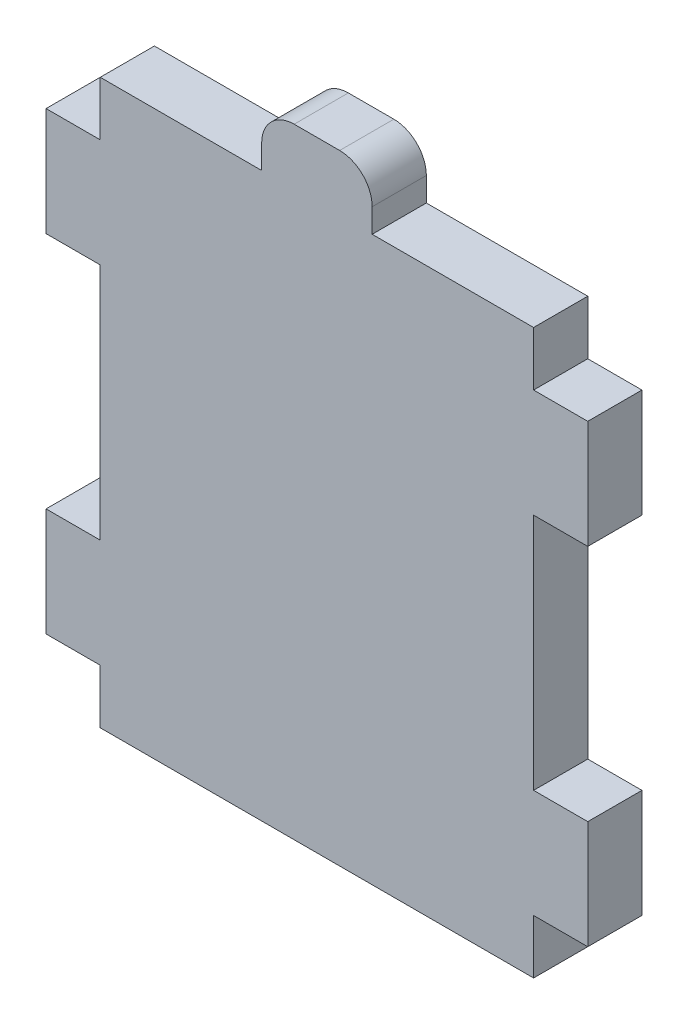
ISO-10303-21;
HEADER;
FILE_DESCRIPTION(('STEP AP214'),'2;1');
FILE_NAME('part.step','',(''),(''),'','','');
FILE_SCHEMA(('AUTOMOTIVE_DESIGN { 1 0 10303 214 1 1 1 1 }'));
ENDSEC;
DATA;
#1=APPLICATION_CONTEXT('core data for automotive mechanical design processes');
#2=APPLICATION_PROTOCOL_DEFINITION('international standard','automotive_design',2000,#1);
#3=PRODUCT_CONTEXT('',#1,'mechanical');
#4=PRODUCT('Part','Part','',(#3));
#5=PRODUCT_RELATED_PRODUCT_CATEGORY('part','',(#4));
#6=PRODUCT_DEFINITION_FORMATION('','',#4);
#7=PRODUCT_DEFINITION_CONTEXT('part definition',#1,'design');
#8=PRODUCT_DEFINITION('design','',#6,#7);
#9=PRODUCT_DEFINITION_SHAPE('','',#8);
#10=(LENGTH_UNIT() NAMED_UNIT(*) SI_UNIT(.MILLI.,.METRE.));
#11=(NAMED_UNIT(*) PLANE_ANGLE_UNIT() SI_UNIT($,.RADIAN.));
#12=(NAMED_UNIT(*) SI_UNIT($,.STERADIAN.) SOLID_ANGLE_UNIT());
#13=UNCERTAINTY_MEASURE_WITH_UNIT(LENGTH_MEASURE(1.E-05),#10,'distance_accuracy_value','');
#14=(GEOMETRIC_REPRESENTATION_CONTEXT(3) GLOBAL_UNCERTAINTY_ASSIGNED_CONTEXT((#13)) GLOBAL_UNIT_ASSIGNED_CONTEXT((#10,
#11,#12)) REPRESENTATION_CONTEXT('',''));
#15=CARTESIAN_POINT('',(0.,0.,0.));
#16=DIRECTION('',(0.,0.,1.));
#17=DIRECTION('',(1.,0.,0.));
#18=AXIS2_PLACEMENT_3D('',#15,#16,#17);
#19=CARTESIAN_POINT('',(0.,66.04,6.35));
#20=DIRECTION('',(0.,-1.,0.));
#21=DIRECTION('',(0.,0.,-1.));
#22=AXIS2_PLACEMENT_3D('',#19,#20,#21);
#23=PLANE('',#22);
#24=DIRECTION('',(0.,0.,-1.));
#25=VECTOR('',#24,1.);
#26=CARTESIAN_POINT('',(31.877,66.04,6.35));
#27=LINE('',#26,#25);
#28=CARTESIAN_POINT('',(31.877,66.04,6.35));
#29=VERTEX_POINT('',#28);
#30=CARTESIAN_POINT('',(31.877,66.04,0.));
#31=VERTEX_POINT('',#30);
#32=EDGE_CURVE('E440',#29,#31,#27,.T.);
#33=ORIENTED_EDGE('',*,*,#32,.F.);
#34=DIRECTION('',(-1.,0.,0.));
#35=VECTOR('',#34,1.);
#36=CARTESIAN_POINT('',(0.,66.04,6.35));
#37=LINE('',#36,#35);
#38=CARTESIAN_POINT('',(50.8,66.04,6.35));
#39=VERTEX_POINT('',#38);
#40=EDGE_CURVE('E361',#39,#29,#37,.T.);
#41=ORIENTED_EDGE('',*,*,#40,.F.);
#42=DIRECTION('',(0.,0.,-1.));
#43=VECTOR('',#42,1.);
#44=CARTESIAN_POINT('',(50.8,66.04,6.35));
#45=LINE('',#44,#43);
#46=CARTESIAN_POINT('',(50.8,66.04,0.));
#47=VERTEX_POINT('',#46);
#48=EDGE_CURVE('E381',#39,#47,#45,.T.);
#49=ORIENTED_EDGE('',*,*,#48,.T.);
#50=DIRECTION('',(-1.,0.,0.));
#51=VECTOR('',#50,1.);
#52=CARTESIAN_POINT('',(0.,66.04,0.));
#53=LINE('',#52,#51);
#54=EDGE_CURVE('E376',#47,#31,#53,.T.);
#55=ORIENTED_EDGE('',*,*,#54,.T.);
#56=EDGE_LOOP('',(#33,#41,#49,#55));
#57=FACE_BOUND('',#56,.T.);
#58=ADVANCED_FACE('F39',(#57),#23,.F.);
#59=CARTESIAN_POINT('',(50.8,0.,6.35));
#60=DIRECTION('',(-1.,0.,0.));
#61=DIRECTION('',(0.,-1.,0.));
#62=AXIS2_PLACEMENT_3D('',#59,#60,#61);
#63=PLANE('',#62);
#64=DIRECTION('',(0.,0.,-1.));
#65=VECTOR('',#64,1.);
#66=CARTESIAN_POINT('',(50.8,46.99,6.35));
#67=LINE('',#66,#65);
#68=CARTESIAN_POINT('',(50.8,46.99,6.35));
#69=VERTEX_POINT('',#68);
#70=CARTESIAN_POINT('',(50.8,46.99,0.));
#71=VERTEX_POINT('',#70);
#72=EDGE_CURVE('E235',#69,#71,#67,.T.);
#73=ORIENTED_EDGE('',*,*,#72,.F.);
#74=DIRECTION('',(0.,1.,0.));
#75=VECTOR('',#74,1.);
#76=CARTESIAN_POINT('',(50.8,0.,6.35));
#77=LINE('',#76,#75);
#78=CARTESIAN_POINT('',(50.8,19.05,6.35));
#79=VERTEX_POINT('',#78);
#80=EDGE_CURVE('E360',#79,#69,#77,.T.);
#81=ORIENTED_EDGE('',*,*,#80,.F.);
#82=DIRECTION('',(0.,0.,-1.));
#83=VECTOR('',#82,1.);
#84=CARTESIAN_POINT('',(50.8,19.05,6.35));
#85=LINE('',#84,#83);
#86=CARTESIAN_POINT('',(50.8,19.05,0.));
#87=VERTEX_POINT('',#86);
#88=EDGE_CURVE('E279',#79,#87,#85,.T.);
#89=ORIENTED_EDGE('',*,*,#88,.T.);
#90=DIRECTION('',(0.,1.,0.));
#91=VECTOR('',#90,1.);
#92=CARTESIAN_POINT('',(50.8,0.,0.));
#93=LINE('',#92,#91);
#94=EDGE_CURVE('E375',#87,#71,#93,.T.);
#95=ORIENTED_EDGE('',*,*,#94,.T.);
#96=EDGE_LOOP('',(#73,#81,#89,#95));
#97=FACE_BOUND('',#96,.T.);
#98=ADVANCED_FACE('F473',(#97),#63,.F.);
#99=DIRECTION('',(0.,0.,-1.));
#100=VECTOR('',#99,1.);
#101=CARTESIAN_POINT('',(50.8,59.69,6.35));
#102=LINE('',#101,#100);
#103=CARTESIAN_POINT('',(50.8,59.69,6.35));
#104=VERTEX_POINT('',#103);
#105=CARTESIAN_POINT('',(50.8,59.69,0.));
#106=VERTEX_POINT('',#105);
#107=EDGE_CURVE('E258',#104,#106,#102,.T.);
#108=ORIENTED_EDGE('',*,*,#107,.T.);
#109=EDGE_CURVE('E371',#106,#47,#93,.T.);
#110=ORIENTED_EDGE('',*,*,#109,.T.);
#111=ORIENTED_EDGE('',*,*,#48,.F.);
#112=EDGE_CURVE('E62',#104,#39,#77,.T.);
#113=ORIENTED_EDGE('',*,*,#112,.F.);
#114=EDGE_LOOP('',(#108,#110,#111,#113));
#115=FACE_BOUND('',#114,.T.);
#116=ADVANCED_FACE('F467',(#115),#63,.F.);
#117=DIRECTION('',(0.,0.,-1.));
#118=VECTOR('',#117,1.);
#119=CARTESIAN_POINT('',(50.8,6.35000000000001,6.35));
#120=LINE('',#119,#118);
#121=CARTESIAN_POINT('',(50.8,6.35000000000001,6.35));
#122=VERTEX_POINT('',#121);
#123=CARTESIAN_POINT('',(50.8,6.35000000000001,0.));
#124=VERTEX_POINT('',#123);
#125=EDGE_CURVE('E282',#122,#124,#120,.T.);
#126=ORIENTED_EDGE('',*,*,#125,.F.);
#127=CARTESIAN_POINT('',(50.8,0.,6.35));
#128=VERTEX_POINT('',#127);
#129=EDGE_CURVE('E356',#128,#122,#77,.T.);
#130=ORIENTED_EDGE('',*,*,#129,.F.);
#131=DIRECTION('',(0.,0.,-1.));
#132=VECTOR('',#131,1.);
#133=CARTESIAN_POINT('',(50.8,0.,6.35));
#134=LINE('',#133,#132);
#135=CARTESIAN_POINT('',(50.8,0.,0.));
#136=VERTEX_POINT('',#135);
#137=EDGE_CURVE('E47',#128,#136,#134,.T.);
#138=ORIENTED_EDGE('',*,*,#137,.T.);
#139=EDGE_CURVE('E372',#136,#124,#93,.T.);
#140=ORIENTED_EDGE('',*,*,#139,.T.);
#141=EDGE_LOOP('',(#126,#130,#138,#140));
#142=FACE_BOUND('',#141,.T.);
#143=ADVANCED_FACE('F389',(#142),#63,.F.);
#144=CARTESIAN_POINT('',(0.,0.,6.35));
#145=DIRECTION('',(1.,0.,0.));
#146=DIRECTION('',(0.,0.,-1.));
#147=AXIS2_PLACEMENT_3D('',#144,#145,#146);
#148=PLANE('',#147);
#149=DIRECTION('',(0.,0.,-1.));
#150=VECTOR('',#149,1.);
#151=CARTESIAN_POINT('',(0.,19.05,6.35));
#152=LINE('',#151,#150);
#153=CARTESIAN_POINT('',(0.,19.05,6.35));
#154=VERTEX_POINT('',#153);
#155=CARTESIAN_POINT('',(0.,19.05,0.));
#156=VERTEX_POINT('',#155);
#157=EDGE_CURVE('E293',#154,#156,#152,.T.);
#158=ORIENTED_EDGE('',*,*,#157,.F.);
#159=DIRECTION('',(0.,-1.,0.));
#160=VECTOR('',#159,1.);
#161=CARTESIAN_POINT('',(0.,0.,6.35));
#162=LINE('',#161,#160);
#163=CARTESIAN_POINT('',(0.,46.99,6.35));
#164=VERTEX_POINT('',#163);
#165=EDGE_CURVE('E353',#164,#154,#162,.T.);
#166=ORIENTED_EDGE('',*,*,#165,.F.);
#167=DIRECTION('',(0.,0.,-1.));
#168=VECTOR('',#167,1.);
#169=CARTESIAN_POINT('',(0.,46.99,6.35));
#170=LINE('',#169,#168);
#171=CARTESIAN_POINT('',(0.,46.99,0.));
#172=VERTEX_POINT('',#171);
#173=EDGE_CURVE('E332',#164,#172,#170,.T.);
#174=ORIENTED_EDGE('',*,*,#173,.T.);
#175=DIRECTION('',(0.,-1.,0.));
#176=VECTOR('',#175,1.);
#177=CARTESIAN_POINT('',(0.,0.,0.));
#178=LINE('',#177,#176);
#179=EDGE_CURVE('E369',#172,#156,#178,.T.);
#180=ORIENTED_EDGE('',*,*,#179,.T.);
#181=EDGE_LOOP('',(#158,#166,#174,#180));
#182=FACE_BOUND('',#181,.T.);
#183=ADVANCED_FACE('F41',(#182),#148,.F.);
#184=DIRECTION('',(0.,0.,-1.));
#185=VECTOR('',#184,1.);
#186=CARTESIAN_POINT('',(0.,6.35,6.35));
#187=LINE('',#186,#185);
#188=CARTESIAN_POINT('',(0.,6.35,6.35));
#189=VERTEX_POINT('',#188);
#190=CARTESIAN_POINT('',(0.,6.35,0.));
#191=VERTEX_POINT('',#190);
#192=EDGE_CURVE('E307',#189,#191,#187,.T.);
#193=ORIENTED_EDGE('',*,*,#192,.T.);
#194=CARTESIAN_POINT('',(0.,0.,0.));
#195=VERTEX_POINT('',#194);
#196=EDGE_CURVE('E348',#191,#195,#178,.T.);
#197=ORIENTED_EDGE('',*,*,#196,.T.);
#198=DIRECTION('',(0.,0.,-1.));
#199=VECTOR('',#198,1.);
#200=CARTESIAN_POINT('',(0.,0.,6.35));
#201=LINE('',#200,#199);
#202=CARTESIAN_POINT('',(0.,0.,6.35));
#203=VERTEX_POINT('',#202);
#204=EDGE_CURVE('E11',#203,#195,#201,.T.);
#205=ORIENTED_EDGE('',*,*,#204,.F.);
#206=EDGE_CURVE('E354',#189,#203,#162,.T.);
#207=ORIENTED_EDGE('',*,*,#206,.F.);
#208=EDGE_LOOP('',(#193,#197,#205,#207));
#209=FACE_BOUND('',#208,.T.);
#210=ADVANCED_FACE('F403',(#209),#148,.F.);
#211=DIRECTION('',(0.,0.,-1.));
#212=VECTOR('',#211,1.);
#213=CARTESIAN_POINT('',(0.,59.69,6.35));
#214=LINE('',#213,#212);
#215=CARTESIAN_POINT('',(0.,59.69,6.35));
#216=VERTEX_POINT('',#215);
#217=CARTESIAN_POINT('',(0.,59.69,0.));
#218=VERTEX_POINT('',#217);
#219=EDGE_CURVE('E345',#216,#218,#214,.T.);
#220=ORIENTED_EDGE('',*,*,#219,.F.);
#221=CARTESIAN_POINT('',(0.,66.04,6.35));
#222=VERTEX_POINT('',#221);
#223=EDGE_CURVE('E349',#222,#216,#162,.T.);
#224=ORIENTED_EDGE('',*,*,#223,.F.);
#225=DIRECTION('',(0.,0.,-1.));
#226=VECTOR('',#225,1.);
#227=CARTESIAN_POINT('',(0.,66.04,6.35));
#228=LINE('',#227,#226);
#229=CARTESIAN_POINT('',(0.,66.04,0.));
#230=VERTEX_POINT('',#229);
#231=EDGE_CURVE('E364',#222,#230,#228,.T.);
#232=ORIENTED_EDGE('',*,*,#231,.T.);
#233=EDGE_CURVE('E365',#230,#218,#178,.T.);
#234=ORIENTED_EDGE('',*,*,#233,.T.);
#235=EDGE_LOOP('',(#220,#224,#232,#234));
#236=FACE_BOUND('',#235,.T.);
#237=ADVANCED_FACE('F434',(#236),#148,.F.);
#238=CARTESIAN_POINT('',(0.,0.,6.35));
#239=DIRECTION('',(0.,1.,0.));
#240=DIRECTION('',(0.,0.,1.));
#241=AXIS2_PLACEMENT_3D('',#238,#239,#240);
#242=PLANE('',#241);
#243=DIRECTION('',(1.,0.,0.));
#244=VECTOR('',#243,1.);
#245=CARTESIAN_POINT('',(0.,0.,0.));
#246=LINE('',#245,#244);
#247=EDGE_CURVE('E368',#195,#136,#246,.T.);
#248=ORIENTED_EDGE('',*,*,#247,.T.);
#249=ORIENTED_EDGE('',*,*,#137,.F.);
#250=DIRECTION('',(1.,0.,0.));
#251=VECTOR('',#250,1.);
#252=CARTESIAN_POINT('',(0.,0.,6.35));
#253=LINE('',#252,#251);
#254=EDGE_CURVE('E352',#203,#128,#253,.T.);
#255=ORIENTED_EDGE('',*,*,#254,.F.);
#256=ORIENTED_EDGE('',*,*,#204,.T.);
#257=EDGE_LOOP('',(#248,#249,#255,#256));
#258=FACE_BOUND('',#257,.T.);
#259=ADVANCED_FACE('F401',(#258),#242,.F.);
#260=CARTESIAN_POINT('',(18.923,66.04,6.35));
#261=VERTEX_POINT('',#260);
#262=EDGE_CURVE('E359',#261,#222,#37,.T.);
#263=ORIENTED_EDGE('',*,*,#262,.F.);
#264=DIRECTION('',(0.,0.,-1.));
#265=VECTOR('',#264,1.);
#266=CARTESIAN_POINT('',(18.923,66.04,6.35));
#267=LINE('',#266,#265);
#268=CARTESIAN_POINT('',(18.923,66.04,0.));
#269=VERTEX_POINT('',#268);
#270=EDGE_CURVE('E439',#261,#269,#267,.T.);
#271=ORIENTED_EDGE('',*,*,#270,.T.);
#272=EDGE_CURVE('E234',#269,#230,#53,.T.);
#273=ORIENTED_EDGE('',*,*,#272,.T.);
#274=ORIENTED_EDGE('',*,*,#231,.F.);
#275=EDGE_LOOP('',(#263,#271,#273,#274));
#276=FACE_BOUND('',#275,.T.);
#277=ADVANCED_FACE('F438',(#276),#23,.F.);
#278=CARTESIAN_POINT('',(0.,0.,6.35));
#279=DIRECTION('',(0.,0.,-1.));
#280=DIRECTION('',(-1.,0.,0.));
#281=AXIS2_PLACEMENT_3D('',#278,#279,#280);
#282=PLANE('',#281);
#283=ORIENTED_EDGE('',*,*,#223,.T.);
#284=DIRECTION('',(-1.,0.,0.));
#285=VECTOR('',#284,1.);
#286=CARTESIAN_POINT('',(0.,59.69,6.35));
#287=LINE('',#286,#285);
#288=CARTESIAN_POINT('',(-6.35,59.69,6.35));
#289=VERTEX_POINT('',#288);
#290=EDGE_CURVE('E325',#216,#289,#287,.T.);
#291=ORIENTED_EDGE('',*,*,#290,.T.);
#292=DIRECTION('',(0.,-1.,0.));
#293=VECTOR('',#292,1.);
#294=CARTESIAN_POINT('',(-6.35,59.69,6.35));
#295=LINE('',#294,#293);
#296=CARTESIAN_POINT('',(-6.35,46.99,6.35));
#297=VERTEX_POINT('',#296);
#298=EDGE_CURVE('E327',#289,#297,#295,.T.);
#299=ORIENTED_EDGE('',*,*,#298,.T.);
#300=DIRECTION('',(1.,0.,0.));
#301=VECTOR('',#300,1.);
#302=CARTESIAN_POINT('',(0.,46.99,6.35));
#303=LINE('',#302,#301);
#304=EDGE_CURVE('E330',#297,#164,#303,.T.);
#305=ORIENTED_EDGE('',*,*,#304,.T.);
#306=ORIENTED_EDGE('',*,*,#165,.T.);
#307=DIRECTION('',(-1.,0.,0.));
#308=VECTOR('',#307,1.);
#309=CARTESIAN_POINT('',(0.,19.05,6.35));
#310=LINE('',#309,#308);
#311=CARTESIAN_POINT('',(-6.35,19.05,6.35));
#312=VERTEX_POINT('',#311);
#313=EDGE_CURVE('E315',#154,#312,#310,.T.);
#314=ORIENTED_EDGE('',*,*,#313,.T.);
#315=DIRECTION('',(0.,-1.,0.));
#316=VECTOR('',#315,1.);
#317=CARTESIAN_POINT('',(-6.35,6.35,6.35));
#318=LINE('',#317,#316);
#319=CARTESIAN_POINT('',(-6.35,6.35,6.35));
#320=VERTEX_POINT('',#319);
#321=EDGE_CURVE('E322',#312,#320,#318,.T.);
#322=ORIENTED_EDGE('',*,*,#321,.T.);
#323=DIRECTION('',(1.,0.,0.));
#324=VECTOR('',#323,1.);
#325=CARTESIAN_POINT('',(0.,6.35,6.35));
#326=LINE('',#325,#324);
#327=EDGE_CURVE('E310',#320,#189,#326,.T.);
#328=ORIENTED_EDGE('',*,*,#327,.T.);
#329=ORIENTED_EDGE('',*,*,#206,.T.);
#330=ORIENTED_EDGE('',*,*,#254,.T.);
#331=ORIENTED_EDGE('',*,*,#129,.T.);
#332=DIRECTION('',(1.,0.,0.));
#333=VECTOR('',#332,1.);
#334=CARTESIAN_POINT('',(50.8,6.35000000000001,6.35));
#335=LINE('',#334,#333);
#336=CARTESIAN_POINT('',(57.15,6.35000000000001,6.35));
#337=VERTEX_POINT('',#336);
#338=EDGE_CURVE('E288',#122,#337,#335,.T.);
#339=ORIENTED_EDGE('',*,*,#338,.T.);
#340=DIRECTION('',(0.,1.,0.));
#341=VECTOR('',#340,1.);
#342=CARTESIAN_POINT('',(57.15,6.35000000000001,6.35));
#343=LINE('',#342,#341);
#344=CARTESIAN_POINT('',(57.15,19.05,6.35));
#345=VERTEX_POINT('',#344);
#346=EDGE_CURVE('E295',#337,#345,#343,.T.);
#347=ORIENTED_EDGE('',*,*,#346,.T.);
#348=DIRECTION('',(-1.,0.,0.));
#349=VECTOR('',#348,1.);
#350=CARTESIAN_POINT('',(50.8,19.05,6.35));
#351=LINE('',#350,#349);
#352=EDGE_CURVE('E284',#345,#79,#351,.T.);
#353=ORIENTED_EDGE('',*,*,#352,.T.);
#354=ORIENTED_EDGE('',*,*,#80,.T.);
#355=DIRECTION('',(1.,0.,0.));
#356=VECTOR('',#355,1.);
#357=CARTESIAN_POINT('',(50.8,46.99,6.35));
#358=LINE('',#357,#356);
#359=CARTESIAN_POINT('',(57.15,46.99,6.35));
#360=VERTEX_POINT('',#359);
#361=EDGE_CURVE('E265',#69,#360,#358,.T.);
#362=ORIENTED_EDGE('',*,*,#361,.T.);
#363=DIRECTION('',(0.,1.,0.));
#364=VECTOR('',#363,1.);
#365=CARTESIAN_POINT('',(57.15,59.69,6.35));
#366=LINE('',#365,#364);
#367=CARTESIAN_POINT('',(57.15,59.69,6.35));
#368=VERTEX_POINT('',#367);
#369=EDGE_CURVE('E271',#360,#368,#366,.T.);
#370=ORIENTED_EDGE('',*,*,#369,.T.);
#371=DIRECTION('',(-1.,0.,0.));
#372=VECTOR('',#371,1.);
#373=CARTESIAN_POINT('',(50.8,59.69,6.35));
#374=LINE('',#373,#372);
#375=EDGE_CURVE('E260',#368,#104,#374,.T.);
#376=ORIENTED_EDGE('',*,*,#375,.T.);
#377=ORIENTED_EDGE('',*,*,#112,.T.);
#378=ORIENTED_EDGE('',*,*,#40,.T.);
#379=DIRECTION('',(0.,1.,0.));
#380=VECTOR('',#379,1.);
#381=CARTESIAN_POINT('',(31.877,66.04,6.35));
#382=LINE('',#381,#380);
#383=CARTESIAN_POINT('',(31.877,68.834,6.35));
#384=VERTEX_POINT('',#383);
#385=EDGE_CURVE('E250',#29,#384,#382,.T.);
#386=ORIENTED_EDGE('',*,*,#385,.T.);
#387=CARTESIAN_POINT('',(28.067,68.834,6.35));
#388=DIRECTION('',(0.,0.,1.));
#389=DIRECTION('',(-1.,0.,0.));
#390=AXIS2_PLACEMENT_3D('',#387,#388,#389);
#391=CIRCLE('',#390,3.80999999999999);
#392=CARTESIAN_POINT('',(28.067,72.644,6.35));
#393=VERTEX_POINT('',#392);
#394=EDGE_CURVE('E248',#384,#393,#391,.T.);
#395=ORIENTED_EDGE('',*,*,#394,.T.);
#396=DIRECTION('',(-1.,0.,0.));
#397=VECTOR('',#396,1.);
#398=CARTESIAN_POINT('',(22.733,72.644,6.35));
#399=LINE('',#398,#397);
#400=CARTESIAN_POINT('',(22.733,72.644,6.35));
#401=VERTEX_POINT('',#400);
#402=EDGE_CURVE('E246',#393,#401,#399,.T.);
#403=ORIENTED_EDGE('',*,*,#402,.T.);
#404=CARTESIAN_POINT('',(22.733,68.834,6.35));
#405=DIRECTION('',(0.,0.,1.));
#406=DIRECTION('',(-1.,0.,0.));
#407=AXIS2_PLACEMENT_3D('',#404,#405,#406);
#408=CIRCLE('',#407,3.80999999999999);
#409=CARTESIAN_POINT('',(18.923,68.834,6.35));
#410=VERTEX_POINT('',#409);
#411=EDGE_CURVE('E229',#401,#410,#408,.T.);
#412=ORIENTED_EDGE('',*,*,#411,.T.);
#413=DIRECTION('',(0.,-1.,0.));
#414=VECTOR('',#413,1.);
#415=CARTESIAN_POINT('',(18.923,66.04,6.35));
#416=LINE('',#415,#414);
#417=EDGE_CURVE('E226',#410,#261,#416,.T.);
#418=ORIENTED_EDGE('',*,*,#417,.T.);
#419=ORIENTED_EDGE('',*,*,#262,.T.);
#420=EDGE_LOOP('',(#283,#291,#299,#305,#306,#314,#322,#328,#329,#330,#331,#339,#347,#353,#354,
#362,#370,#376,#377,#378,#386,#395,#403,#412,#418,#419));
#421=FACE_BOUND('',#420,.T.);
#422=ADVANCED_FACE('F399',(#421),#282,.F.);
#423=CARTESIAN_POINT('',(0.,0.,0.));
#424=DIRECTION('',(0.,0.,-1.));
#425=DIRECTION('',(-1.,0.,0.));
#426=AXIS2_PLACEMENT_3D('',#423,#424,#425);
#427=PLANE('',#426);
#428=ORIENTED_EDGE('',*,*,#233,.F.);
#429=ORIENTED_EDGE('',*,*,#272,.F.);
#430=DIRECTION('',(0.,-1.,0.));
#431=VECTOR('',#430,1.);
#432=CARTESIAN_POINT('',(18.923,66.04,0.));
#433=LINE('',#432,#431);
#434=CARTESIAN_POINT('',(18.923,68.834,0.));
#435=VERTEX_POINT('',#434);
#436=EDGE_CURVE('E54',#435,#269,#433,.T.);
#437=ORIENTED_EDGE('',*,*,#436,.F.);
#438=CARTESIAN_POINT('',(22.733,68.834,0.));
#439=DIRECTION('',(0.,0.,1.));
#440=DIRECTION('',(-1.,0.,0.));
#441=AXIS2_PLACEMENT_3D('',#438,#439,#440);
#442=CIRCLE('',#441,3.80999999999999);
#443=CARTESIAN_POINT('',(22.733,72.644,0.));
#444=VERTEX_POINT('',#443);
#445=EDGE_CURVE('E216',#444,#435,#442,.T.);
#446=ORIENTED_EDGE('',*,*,#445,.F.);
#447=DIRECTION('',(-1.,0.,0.));
#448=VECTOR('',#447,1.);
#449=CARTESIAN_POINT('',(22.733,72.644,0.));
#450=LINE('',#449,#448);
#451=CARTESIAN_POINT('',(28.067,72.644,0.));
#452=VERTEX_POINT('',#451);
#453=EDGE_CURVE('E225',#452,#444,#450,.T.);
#454=ORIENTED_EDGE('',*,*,#453,.F.);
#455=CARTESIAN_POINT('',(28.067,68.834,0.));
#456=DIRECTION('',(0.,0.,1.));
#457=DIRECTION('',(-1.,0.,0.));
#458=AXIS2_PLACEMENT_3D('',#455,#456,#457);
#459=CIRCLE('',#458,3.80999999999999);
#460=CARTESIAN_POINT('',(31.877,68.834,0.));
#461=VERTEX_POINT('',#460);
#462=EDGE_CURVE('E241',#461,#452,#459,.T.);
#463=ORIENTED_EDGE('',*,*,#462,.F.);
#464=DIRECTION('',(0.,1.,0.));
#465=VECTOR('',#464,1.);
#466=CARTESIAN_POINT('',(31.877,66.04,0.));
#467=LINE('',#466,#465);
#468=EDGE_CURVE('E236',#31,#461,#467,.T.);
#469=ORIENTED_EDGE('',*,*,#468,.F.);
#470=ORIENTED_EDGE('',*,*,#54,.F.);
#471=ORIENTED_EDGE('',*,*,#109,.F.);
#472=DIRECTION('',(-1.,0.,0.));
#473=VECTOR('',#472,1.);
#474=CARTESIAN_POINT('',(50.8,59.69,0.));
#475=LINE('',#474,#473);
#476=CARTESIAN_POINT('',(57.15,59.69,0.));
#477=VERTEX_POINT('',#476);
#478=EDGE_CURVE('E261',#477,#106,#475,.T.);
#479=ORIENTED_EDGE('',*,*,#478,.F.);
#480=DIRECTION('',(0.,1.,0.));
#481=VECTOR('',#480,1.);
#482=CARTESIAN_POINT('',(57.15,59.69,0.));
#483=LINE('',#482,#481);
#484=CARTESIAN_POINT('',(57.15,46.99,0.));
#485=VERTEX_POINT('',#484);
#486=EDGE_CURVE('E264',#485,#477,#483,.T.);
#487=ORIENTED_EDGE('',*,*,#486,.F.);
#488=DIRECTION('',(1.,0.,0.));
#489=VECTOR('',#488,1.);
#490=CARTESIAN_POINT('',(50.8,46.99,0.));
#491=LINE('',#490,#489);
#492=EDGE_CURVE('E267',#71,#485,#491,.T.);
#493=ORIENTED_EDGE('',*,*,#492,.F.);
#494=ORIENTED_EDGE('',*,*,#94,.F.);
#495=DIRECTION('',(-1.,0.,0.));
#496=VECTOR('',#495,1.);
#497=CARTESIAN_POINT('',(50.8,19.05,0.));
#498=LINE('',#497,#496);
#499=CARTESIAN_POINT('',(57.15,19.05,0.));
#500=VERTEX_POINT('',#499);
#501=EDGE_CURVE('E285',#500,#87,#498,.T.);
#502=ORIENTED_EDGE('',*,*,#501,.F.);
#503=DIRECTION('',(0.,1.,0.));
#504=VECTOR('',#503,1.);
#505=CARTESIAN_POINT('',(57.15,6.35000000000001,0.));
#506=LINE('',#505,#504);
#507=CARTESIAN_POINT('',(57.15,6.35000000000001,0.));
#508=VERTEX_POINT('',#507);
#509=EDGE_CURVE('E287',#508,#500,#506,.T.);
#510=ORIENTED_EDGE('',*,*,#509,.F.);
#511=DIRECTION('',(1.,0.,0.));
#512=VECTOR('',#511,1.);
#513=CARTESIAN_POINT('',(50.8,6.35000000000001,0.));
#514=LINE('',#513,#512);
#515=EDGE_CURVE('E290',#124,#508,#514,.T.);
#516=ORIENTED_EDGE('',*,*,#515,.F.);
#517=ORIENTED_EDGE('',*,*,#139,.F.);
#518=ORIENTED_EDGE('',*,*,#247,.F.);
#519=ORIENTED_EDGE('',*,*,#196,.F.);
#520=DIRECTION('',(1.,0.,0.));
#521=VECTOR('',#520,1.);
#522=CARTESIAN_POINT('',(0.,6.35,0.));
#523=LINE('',#522,#521);
#524=CARTESIAN_POINT('',(-6.35,6.35,0.));
#525=VERTEX_POINT('',#524);
#526=EDGE_CURVE('E311',#525,#191,#523,.T.);
#527=ORIENTED_EDGE('',*,*,#526,.F.);
#528=DIRECTION('',(0.,-1.,0.));
#529=VECTOR('',#528,1.);
#530=CARTESIAN_POINT('',(-6.35,6.35,0.));
#531=LINE('',#530,#529);
#532=CARTESIAN_POINT('',(-6.35,19.05,0.));
#533=VERTEX_POINT('',#532);
#534=EDGE_CURVE('E314',#533,#525,#531,.T.);
#535=ORIENTED_EDGE('',*,*,#534,.F.);
#536=DIRECTION('',(-1.,0.,0.));
#537=VECTOR('',#536,1.);
#538=CARTESIAN_POINT('',(0.,19.05,0.));
#539=LINE('',#538,#537);
#540=EDGE_CURVE('E317',#156,#533,#539,.T.);
#541=ORIENTED_EDGE('',*,*,#540,.F.);
#542=ORIENTED_EDGE('',*,*,#179,.F.);
#543=DIRECTION('',(1.,0.,0.));
#544=VECTOR('',#543,1.);
#545=CARTESIAN_POINT('',(0.,46.99,0.));
#546=LINE('',#545,#544);
#547=CARTESIAN_POINT('',(-6.35,46.99,0.));
#548=VERTEX_POINT('',#547);
#549=EDGE_CURVE('E328',#548,#172,#546,.T.);
#550=ORIENTED_EDGE('',*,*,#549,.F.);
#551=DIRECTION('',(0.,-1.,0.));
#552=VECTOR('',#551,1.);
#553=CARTESIAN_POINT('',(-6.35,59.69,0.));
#554=LINE('',#553,#552);
#555=CARTESIAN_POINT('',(-6.35,59.69,0.));
#556=VERTEX_POINT('',#555);
#557=EDGE_CURVE('E334',#556,#548,#554,.T.);
#558=ORIENTED_EDGE('',*,*,#557,.F.);
#559=DIRECTION('',(-1.,0.,0.));
#560=VECTOR('',#559,1.);
#561=CARTESIAN_POINT('',(0.,59.69,0.));
#562=LINE('',#561,#560);
#563=EDGE_CURVE('E319',#218,#556,#562,.T.);
#564=ORIENTED_EDGE('',*,*,#563,.F.);
#565=EDGE_LOOP('',(#428,#429,#437,#446,#454,#463,#469,#470,#471,#479,#487,#493,#494,#502,#510,
#516,#517,#518,#519,#527,#535,#541,#542,#550,#558,#564));
#566=FACE_BOUND('',#565,.T.);
#567=ADVANCED_FACE('F233',(#566),#427,.T.);
#568=CARTESIAN_POINT('',(0.,59.69,6.35));
#569=DIRECTION('',(0.,-1.,0.));
#570=DIRECTION('',(0.,0.,-1.));
#571=AXIS2_PLACEMENT_3D('',#568,#569,#570);
#572=PLANE('',#571);
#573=ORIENTED_EDGE('',*,*,#563,.T.);
#574=DIRECTION('',(0.,0.,-1.));
#575=VECTOR('',#574,1.);
#576=CARTESIAN_POINT('',(-6.35,59.69,6.35));
#577=LINE('',#576,#575);
#578=EDGE_CURVE('E342',#289,#556,#577,.T.);
#579=ORIENTED_EDGE('',*,*,#578,.F.);
#580=ORIENTED_EDGE('',*,*,#290,.F.);
#581=ORIENTED_EDGE('',*,*,#219,.T.);
#582=EDGE_LOOP('',(#573,#579,#580,#581));
#583=FACE_BOUND('',#582,.T.);
#584=ADVANCED_FACE('F430',(#583),#572,.F.);
#585=CARTESIAN_POINT('',(-6.35,59.69,6.35));
#586=DIRECTION('',(1.,0.,0.));
#587=DIRECTION('',(0.,0.,-1.));
#588=AXIS2_PLACEMENT_3D('',#585,#586,#587);
#589=PLANE('',#588);
#590=ORIENTED_EDGE('',*,*,#557,.T.);
#591=DIRECTION('',(0.,0.,-1.));
#592=VECTOR('',#591,1.);
#593=CARTESIAN_POINT('',(-6.35,46.99,6.35));
#594=LINE('',#593,#592);
#595=EDGE_CURVE('E339',#297,#548,#594,.T.);
#596=ORIENTED_EDGE('',*,*,#595,.F.);
#597=ORIENTED_EDGE('',*,*,#298,.F.);
#598=ORIENTED_EDGE('',*,*,#578,.T.);
#599=EDGE_LOOP('',(#590,#596,#597,#598));
#600=FACE_BOUND('',#599,.T.);
#601=ADVANCED_FACE('F427',(#600),#589,.F.);
#602=CARTESIAN_POINT('',(0.,46.99,6.35));
#603=DIRECTION('',(0.,1.,0.));
#604=DIRECTION('',(0.,0.,1.));
#605=AXIS2_PLACEMENT_3D('',#602,#603,#604);
#606=PLANE('',#605);
#607=ORIENTED_EDGE('',*,*,#549,.T.);
#608=ORIENTED_EDGE('',*,*,#173,.F.);
#609=ORIENTED_EDGE('',*,*,#304,.F.);
#610=ORIENTED_EDGE('',*,*,#595,.T.);
#611=EDGE_LOOP('',(#607,#608,#609,#610));
#612=FACE_BOUND('',#611,.T.);
#613=ADVANCED_FACE('F424',(#612),#606,.F.);
#614=CARTESIAN_POINT('',(0.,19.05,6.35));
#615=DIRECTION('',(0.,-1.,0.));
#616=DIRECTION('',(0.,0.,-1.));
#617=AXIS2_PLACEMENT_3D('',#614,#615,#616);
#618=PLANE('',#617);
#619=ORIENTED_EDGE('',*,*,#540,.T.);
#620=DIRECTION('',(0.,0.,-1.));
#621=VECTOR('',#620,1.);
#622=CARTESIAN_POINT('',(-6.35,19.05,6.35));
#623=LINE('',#622,#621);
#624=EDGE_CURVE('E301',#312,#533,#623,.T.);
#625=ORIENTED_EDGE('',*,*,#624,.F.);
#626=ORIENTED_EDGE('',*,*,#313,.F.);
#627=ORIENTED_EDGE('',*,*,#157,.T.);
#628=EDGE_LOOP('',(#619,#625,#626,#627));
#629=FACE_BOUND('',#628,.T.);
#630=ADVANCED_FACE('F417',(#629),#618,.F.);
#631=CARTESIAN_POINT('',(-6.35,6.35,6.35));
#632=DIRECTION('',(1.,0.,0.));
#633=DIRECTION('',(0.,0.,-1.));
#634=AXIS2_PLACEMENT_3D('',#631,#632,#633);
#635=PLANE('',#634);
#636=ORIENTED_EDGE('',*,*,#534,.T.);
#637=DIRECTION('',(0.,0.,-1.));
#638=VECTOR('',#637,1.);
#639=CARTESIAN_POINT('',(-6.35,6.35,6.35));
#640=LINE('',#639,#638);
#641=EDGE_CURVE('E304',#320,#525,#640,.T.);
#642=ORIENTED_EDGE('',*,*,#641,.F.);
#643=ORIENTED_EDGE('',*,*,#321,.F.);
#644=ORIENTED_EDGE('',*,*,#624,.T.);
#645=EDGE_LOOP('',(#636,#642,#643,#644));
#646=FACE_BOUND('',#645,.T.);
#647=ADVANCED_FACE('F655',(#646),#635,.F.);
#648=CARTESIAN_POINT('',(0.,6.35,6.35));
#649=DIRECTION('',(0.,1.,0.));
#650=DIRECTION('',(0.,0.,1.));
#651=AXIS2_PLACEMENT_3D('',#648,#649,#650);
#652=PLANE('',#651);
#653=ORIENTED_EDGE('',*,*,#526,.T.);
#654=ORIENTED_EDGE('',*,*,#192,.F.);
#655=ORIENTED_EDGE('',*,*,#327,.F.);
#656=ORIENTED_EDGE('',*,*,#641,.T.);
#657=EDGE_LOOP('',(#653,#654,#655,#656));
#658=FACE_BOUND('',#657,.T.);
#659=ADVANCED_FACE('F665',(#658),#652,.F.);
#660=CARTESIAN_POINT('',(50.8,6.35000000000001,6.35));
#661=DIRECTION('',(0.,1.,0.));
#662=DIRECTION('',(-1.,0.,0.));
#663=AXIS2_PLACEMENT_3D('',#660,#661,#662);
#664=PLANE('',#663);
#665=ORIENTED_EDGE('',*,*,#515,.T.);
#666=DIRECTION('',(0.,0.,-1.));
#667=VECTOR('',#666,1.);
#668=CARTESIAN_POINT('',(57.15,6.35000000000001,6.35));
#669=LINE('',#668,#667);
#670=EDGE_CURVE('E269',#337,#508,#669,.T.);
#671=ORIENTED_EDGE('',*,*,#670,.F.);
#672=ORIENTED_EDGE('',*,*,#338,.F.);
#673=ORIENTED_EDGE('',*,*,#125,.T.);
#674=EDGE_LOOP('',(#665,#671,#672,#673));
#675=FACE_BOUND('',#674,.T.);
#676=ADVANCED_FACE('F397',(#675),#664,.F.);
#677=CARTESIAN_POINT('',(57.15,6.35000000000001,6.35));
#678=DIRECTION('',(-1.,0.,0.));
#679=DIRECTION('',(0.,0.,1.));
#680=AXIS2_PLACEMENT_3D('',#677,#678,#679);
#681=PLANE('',#680);
#682=ORIENTED_EDGE('',*,*,#509,.T.);
#683=DIRECTION('',(0.,0.,-1.));
#684=VECTOR('',#683,1.);
#685=CARTESIAN_POINT('',(57.15,19.05,6.35));
#686=LINE('',#685,#684);
#687=EDGE_CURVE('E276',#345,#500,#686,.T.);
#688=ORIENTED_EDGE('',*,*,#687,.F.);
#689=ORIENTED_EDGE('',*,*,#346,.F.);
#690=ORIENTED_EDGE('',*,*,#670,.T.);
#691=EDGE_LOOP('',(#682,#688,#689,#690));
#692=FACE_BOUND('',#691,.T.);
#693=ADVANCED_FACE('F686',(#692),#681,.F.);
#694=CARTESIAN_POINT('',(50.8,19.05,6.35));
#695=DIRECTION('',(0.,-1.,0.));
#696=DIRECTION('',(0.,0.,-1.));
#697=AXIS2_PLACEMENT_3D('',#694,#695,#696);
#698=PLANE('',#697);
#699=ORIENTED_EDGE('',*,*,#501,.T.);
#700=ORIENTED_EDGE('',*,*,#88,.F.);
#701=ORIENTED_EDGE('',*,*,#352,.F.);
#702=ORIENTED_EDGE('',*,*,#687,.T.);
#703=EDGE_LOOP('',(#699,#700,#701,#702));
#704=FACE_BOUND('',#703,.T.);
#705=ADVANCED_FACE('F497',(#704),#698,.F.);
#706=CARTESIAN_POINT('',(50.8,46.99,6.35));
#707=DIRECTION('',(0.,1.,0.));
#708=DIRECTION('',(0.,0.,1.));
#709=AXIS2_PLACEMENT_3D('',#706,#707,#708);
#710=PLANE('',#709);
#711=ORIENTED_EDGE('',*,*,#492,.T.);
#712=DIRECTION('',(0.,0.,-1.));
#713=VECTOR('',#712,1.);
#714=CARTESIAN_POINT('',(57.15,46.99,6.35));
#715=LINE('',#714,#713);
#716=EDGE_CURVE('E239',#360,#485,#715,.T.);
#717=ORIENTED_EDGE('',*,*,#716,.F.);
#718=ORIENTED_EDGE('',*,*,#361,.F.);
#719=ORIENTED_EDGE('',*,*,#72,.T.);
#720=EDGE_LOOP('',(#711,#717,#718,#719));
#721=FACE_BOUND('',#720,.T.);
#722=ADVANCED_FACE('F481',(#721),#710,.F.);
#723=CARTESIAN_POINT('',(57.15,59.69,6.35));
#724=DIRECTION('',(-1.,0.,0.));
#725=DIRECTION('',(0.,0.,1.));
#726=AXIS2_PLACEMENT_3D('',#723,#724,#725);
#727=PLANE('',#726);
#728=ORIENTED_EDGE('',*,*,#486,.T.);
#729=DIRECTION('',(0.,0.,-1.));
#730=VECTOR('',#729,1.);
#731=CARTESIAN_POINT('',(57.15,59.69,6.35));
#732=LINE('',#731,#730);
#733=EDGE_CURVE('E255',#368,#477,#732,.T.);
#734=ORIENTED_EDGE('',*,*,#733,.F.);
#735=ORIENTED_EDGE('',*,*,#369,.F.);
#736=ORIENTED_EDGE('',*,*,#716,.T.);
#737=EDGE_LOOP('',(#728,#734,#735,#736));
#738=FACE_BOUND('',#737,.T.);
#739=ADVANCED_FACE('F489',(#738),#727,.F.);
#740=CARTESIAN_POINT('',(50.8,59.69,6.35));
#741=DIRECTION('',(0.,-1.,0.));
#742=DIRECTION('',(0.,0.,-1.));
#743=AXIS2_PLACEMENT_3D('',#740,#741,#742);
#744=PLANE('',#743);
#745=ORIENTED_EDGE('',*,*,#478,.T.);
#746=ORIENTED_EDGE('',*,*,#107,.F.);
#747=ORIENTED_EDGE('',*,*,#375,.F.);
#748=ORIENTED_EDGE('',*,*,#733,.T.);
#749=EDGE_LOOP('',(#745,#746,#747,#748));
#750=FACE_BOUND('',#749,.T.);
#751=ADVANCED_FACE('F487',(#750),#744,.F.);
#752=CARTESIAN_POINT('',(18.923,66.04,6.35));
#753=DIRECTION('',(1.,0.,0.));
#754=DIRECTION('',(0.,1.,0.));
#755=AXIS2_PLACEMENT_3D('',#752,#753,#754);
#756=PLANE('',#755);
#757=ORIENTED_EDGE('',*,*,#436,.T.);
#758=ORIENTED_EDGE('',*,*,#270,.F.);
#759=ORIENTED_EDGE('',*,*,#417,.F.);
#760=DIRECTION('',(0.,0.,-1.));
#761=VECTOR('',#760,1.);
#762=CARTESIAN_POINT('',(18.923,68.834,6.35));
#763=LINE('',#762,#761);
#764=EDGE_CURVE('E219',#410,#435,#763,.T.);
#765=ORIENTED_EDGE('',*,*,#764,.T.);
#766=EDGE_LOOP('',(#757,#758,#759,#765));
#767=FACE_BOUND('',#766,.T.);
#768=ADVANCED_FACE('F228',(#767),#756,.F.);
#769=CARTESIAN_POINT('',(31.877,66.04,6.35));
#770=DIRECTION('',(-1.,0.,0.));
#771=DIRECTION('',(0.,-1.,0.));
#772=AXIS2_PLACEMENT_3D('',#769,#770,#771);
#773=PLANE('',#772);
#774=ORIENTED_EDGE('',*,*,#468,.T.);
#775=DIRECTION('',(0.,0.,-1.));
#776=VECTOR('',#775,1.);
#777=CARTESIAN_POINT('',(31.877,68.834,6.35));
#778=LINE('',#777,#776);
#779=EDGE_CURVE('E442',#384,#461,#778,.T.);
#780=ORIENTED_EDGE('',*,*,#779,.F.);
#781=ORIENTED_EDGE('',*,*,#385,.F.);
#782=ORIENTED_EDGE('',*,*,#32,.T.);
#783=EDGE_LOOP('',(#774,#780,#781,#782));
#784=FACE_BOUND('',#783,.T.);
#785=ADVANCED_FACE('F464',(#784),#773,.F.);
#786=CARTESIAN_POINT('',(28.067,68.834,6.35));
#787=DIRECTION('',(0.,0.,-1.));
#788=DIRECTION('',(-1.,0.,0.));
#789=AXIS2_PLACEMENT_3D('',#786,#787,#788);
#790=CYLINDRICAL_SURFACE('',#789,3.80999999999999);
#791=ORIENTED_EDGE('',*,*,#462,.T.);
#792=DIRECTION('',(0.,0.,-1.));
#793=VECTOR('',#792,1.);
#794=CARTESIAN_POINT('',(28.067,72.644,6.35));
#795=LINE('',#794,#793);
#796=EDGE_CURVE('E447',#393,#452,#795,.T.);
#797=ORIENTED_EDGE('',*,*,#796,.F.);
#798=ORIENTED_EDGE('',*,*,#394,.F.);
#799=ORIENTED_EDGE('',*,*,#779,.T.);
#800=EDGE_LOOP('',(#791,#797,#798,#799));
#801=FACE_BOUND('',#800,.T.);
#802=ADVANCED_FACE('F454',(#801),#790,.T.);
#803=CARTESIAN_POINT('',(22.733,72.644,6.35));
#804=DIRECTION('',(0.,-1.,0.));
#805=DIRECTION('',(0.,0.,-1.));
#806=AXIS2_PLACEMENT_3D('',#803,#804,#805);
#807=PLANE('',#806);
#808=ORIENTED_EDGE('',*,*,#453,.T.);
#809=DIRECTION('',(0.,0.,-1.));
#810=VECTOR('',#809,1.);
#811=CARTESIAN_POINT('',(22.733,72.644,6.35));
#812=LINE('',#811,#810);
#813=EDGE_CURVE('E222',#401,#444,#812,.T.);
#814=ORIENTED_EDGE('',*,*,#813,.F.);
#815=ORIENTED_EDGE('',*,*,#402,.F.);
#816=ORIENTED_EDGE('',*,*,#796,.T.);
#817=EDGE_LOOP('',(#808,#814,#815,#816));
#818=FACE_BOUND('',#817,.T.);
#819=ADVANCED_FACE('F460',(#818),#807,.F.);
#820=CARTESIAN_POINT('',(22.733,68.834,6.35));
#821=DIRECTION('',(0.,0.,-1.));
#822=DIRECTION('',(-1.,0.,0.));
#823=AXIS2_PLACEMENT_3D('',#820,#821,#822);
#824=CYLINDRICAL_SURFACE('',#823,3.80999999999999);
#825=ORIENTED_EDGE('',*,*,#445,.T.);
#826=ORIENTED_EDGE('',*,*,#764,.F.);
#827=ORIENTED_EDGE('',*,*,#411,.F.);
#828=ORIENTED_EDGE('',*,*,#813,.T.);
#829=EDGE_LOOP('',(#825,#826,#827,#828));
#830=FACE_BOUND('',#829,.T.);
#831=ADVANCED_FACE('F217',(#830),#824,.T.);
#832=CLOSED_SHELL('',(#58,#98,#116,#143,#183,#210,#237,#259,#277,#422,#567,#584,#601,#613,#630,
#647,#659,#676,#693,#705,#722,#739,#751,#768,#785,#802,#819,#831));
#833=MANIFOLD_SOLID_BREP('B2',#832);
#834=ADVANCED_BREP_SHAPE_REPRESENTATION('',(#18,#833),#14);
#835=SHAPE_DEFINITION_REPRESENTATION(#9,#834);
ENDSEC;
END-ISO-10303-21;
